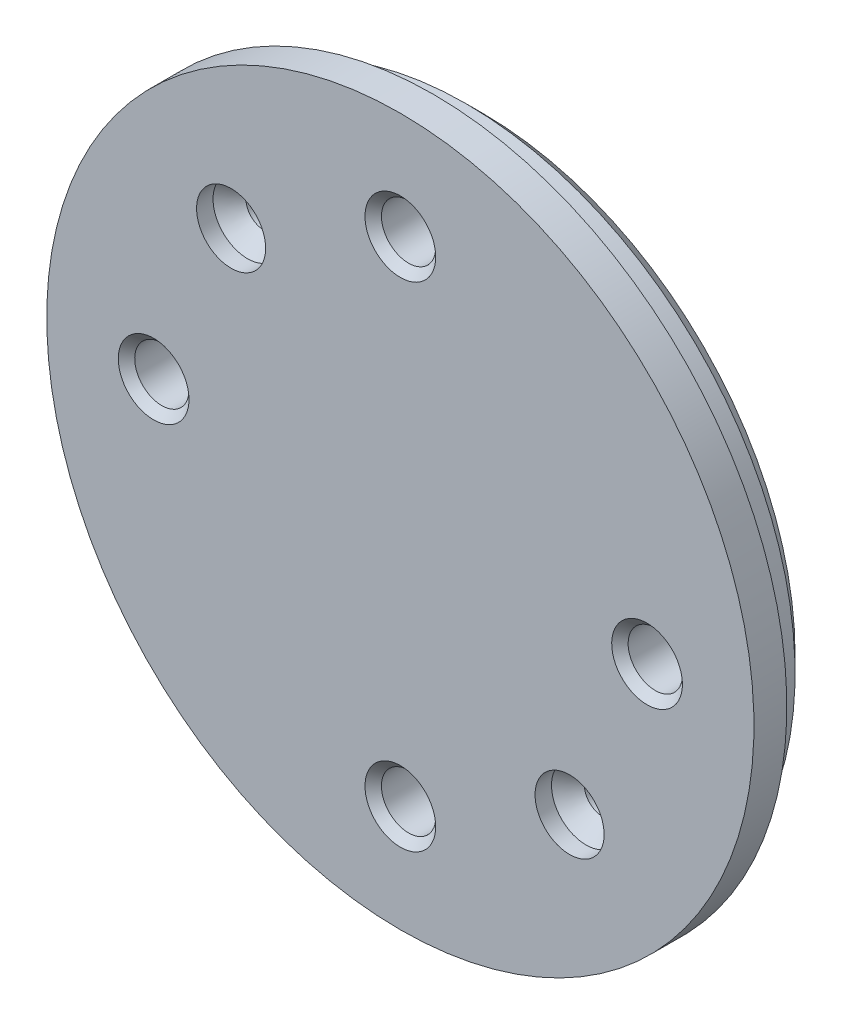
ISO-10303-21;
HEADER;
FILE_DESCRIPTION(('STEP AP214'),'2;1');
FILE_NAME('part.step','',(''),(''),'','','');
FILE_SCHEMA(('AUTOMOTIVE_DESIGN { 1 0 10303 214 1 1 1 1 }'));
ENDSEC;
DATA;
#1=APPLICATION_CONTEXT('core data for automotive mechanical design processes');
#2=APPLICATION_PROTOCOL_DEFINITION('international standard','automotive_design',2000,#1);
#3=PRODUCT_CONTEXT('',#1,'mechanical');
#4=PRODUCT('Part','Part','',(#3));
#5=PRODUCT_RELATED_PRODUCT_CATEGORY('part','',(#4));
#6=PRODUCT_DEFINITION_FORMATION('','',#4);
#7=PRODUCT_DEFINITION_CONTEXT('part definition',#1,'design');
#8=PRODUCT_DEFINITION('design','',#6,#7);
#9=PRODUCT_DEFINITION_SHAPE('','',#8);
#10=(LENGTH_UNIT() NAMED_UNIT(*) SI_UNIT(.MILLI.,.METRE.));
#11=(NAMED_UNIT(*) PLANE_ANGLE_UNIT() SI_UNIT($,.RADIAN.));
#12=(NAMED_UNIT(*) SI_UNIT($,.STERADIAN.) SOLID_ANGLE_UNIT());
#13=UNCERTAINTY_MEASURE_WITH_UNIT(LENGTH_MEASURE(1.E-05),#10,'distance_accuracy_value','');
#14=(GEOMETRIC_REPRESENTATION_CONTEXT(3) GLOBAL_UNCERTAINTY_ASSIGNED_CONTEXT((#13)) GLOBAL_UNIT_ASSIGNED_CONTEXT((#10,
#11,#12)) REPRESENTATION_CONTEXT('',''));
#15=CARTESIAN_POINT('',(0.,0.,0.));
#16=DIRECTION('',(0.,0.,1.));
#17=DIRECTION('',(1.,0.,0.));
#18=AXIS2_PLACEMENT_3D('',#15,#16,#17);
#19=CARTESIAN_POINT('',(0.,0.,0.));
#20=DIRECTION('',(0.,0.,1.));
#21=DIRECTION('',(0.,-1.,0.));
#22=AXIS2_PLACEMENT_3D('',#19,#20,#21);
#23=PLANE('',#22);
#24=CARTESIAN_POINT('',(10.2901453300087,-10.2901453300087,0.));
#25=DIRECTION('',(0.,0.,1.));
#26=DIRECTION('',(-1.,0.,0.));
#27=AXIS2_PLACEMENT_3D('',#24,#25,#26);
#28=CIRCLE('',#27,2.1);
#29=CARTESIAN_POINT('',(8.19014533000868,-10.2901453300087,0.));
#30=VERTEX_POINT('',#29);
#31=EDGE_CURVE('E139',#30,#30,#28,.T.);
#32=ORIENTED_EDGE('',*,*,#31,.F.);
#33=EDGE_LOOP('',(#32));
#34=FACE_BOUND('',#33,.T.);
#35=CARTESIAN_POINT('',(-10.2901453300087,10.2901453300087,0.));
#36=DIRECTION('',(0.,0.,1.));
#37=DIRECTION('',(1.,0.,0.));
#38=AXIS2_PLACEMENT_3D('',#35,#36,#37);
#39=CIRCLE('',#38,2.1);
#40=CARTESIAN_POINT('',(-8.19014533000868,10.2901453300087,0.));
#41=VERTEX_POINT('',#40);
#42=EDGE_CURVE('E108',#41,#41,#39,.T.);
#43=ORIENTED_EDGE('',*,*,#42,.F.);
#44=EDGE_LOOP('',(#43));
#45=FACE_BOUND('',#44,.T.);
#46=CARTESIAN_POINT('',(15.,1.57116660247941E-13,0.));
#47=DIRECTION('',(0.,0.,1.));
#48=DIRECTION('',(0.,-1.,0.));
#49=AXIS2_PLACEMENT_3D('',#46,#47,#48);
#50=CIRCLE('',#49,2.15000000000001);
#51=CARTESIAN_POINT('',(15.,-2.14999999999986,0.));
#52=VERTEX_POINT('',#51);
#53=EDGE_CURVE('E70',#52,#52,#50,.F.);
#54=ORIENTED_EDGE('',*,*,#53,.T.);
#55=EDGE_LOOP('',(#54));
#56=FACE_BOUND('',#55,.T.);
#57=CARTESIAN_POINT('',(0.,-15.,0.));
#58=DIRECTION('',(0.,0.,1.));
#59=DIRECTION('',(0.,-1.,0.));
#60=AXIS2_PLACEMENT_3D('',#57,#58,#59);
#61=CIRCLE('',#60,2.15000000000001);
#62=CARTESIAN_POINT('',(0.,-17.15,0.));
#63=VERTEX_POINT('',#62);
#64=EDGE_CURVE('E78',#63,#63,#61,.F.);
#65=ORIENTED_EDGE('',*,*,#64,.T.);
#66=EDGE_LOOP('',(#65));
#67=FACE_BOUND('',#66,.T.);
#68=CARTESIAN_POINT('',(-15.,0.,0.));
#69=DIRECTION('',(0.,0.,1.));
#70=DIRECTION('',(0.,-1.,0.));
#71=AXIS2_PLACEMENT_3D('',#68,#69,#70);
#72=CIRCLE('',#71,2.15000000000001);
#73=CARTESIAN_POINT('',(-15.,-2.15000000000007,0.));
#74=VERTEX_POINT('',#73);
#75=EDGE_CURVE('E86',#74,#74,#72,.F.);
#76=ORIENTED_EDGE('',*,*,#75,.T.);
#77=EDGE_LOOP('',(#76));
#78=FACE_BOUND('',#77,.T.);
#79=CARTESIAN_POINT('',(0.,15.,0.));
#80=DIRECTION('',(0.,0.,1.));
#81=DIRECTION('',(0.,-1.,0.));
#82=AXIS2_PLACEMENT_3D('',#79,#80,#81);
#83=CIRCLE('',#82,2.15000000000001);
#84=CARTESIAN_POINT('',(0.,12.85,0.));
#85=VERTEX_POINT('',#84);
#86=EDGE_CURVE('E94',#85,#85,#83,.F.);
#87=ORIENTED_EDGE('',*,*,#86,.T.);
#88=EDGE_LOOP('',(#87));
#89=FACE_BOUND('',#88,.T.);
#90=CARTESIAN_POINT('',(0.,0.,0.));
#91=DIRECTION('',(0.,0.,-1.));
#92=DIRECTION('',(0.,1.,0.));
#93=AXIS2_PLACEMENT_3D('',#90,#91,#92);
#94=CIRCLE('',#93,21.5);
#95=CARTESIAN_POINT('',(0.,21.5,0.));
#96=VERTEX_POINT('',#95);
#97=EDGE_CURVE('E116',#96,#96,#94,.T.);
#98=ORIENTED_EDGE('',*,*,#97,.F.);
#99=EDGE_LOOP('',(#98));
#100=FACE_BOUND('',#99,.T.);
#101=ADVANCED_FACE('F45',(#34,#45,#56,#67,#78,#89,#100),#23,.T.);
#102=CARTESIAN_POINT('',(0.,0.,-5.));
#103=DIRECTION('',(0.,0.,-1.));
#104=DIRECTION('',(0.,1.,0.));
#105=AXIS2_PLACEMENT_3D('',#102,#103,#104);
#106=CYLINDRICAL_SURFACE('',#105,21.5);
#107=ORIENTED_EDGE('',*,*,#97,.T.);
#108=EDGE_LOOP('',(#107));
#109=FACE_BOUND('',#108,.T.);
#110=CARTESIAN_POINT('',(0.,0.,-2.));
#111=DIRECTION('',(0.,0.,-1.));
#112=DIRECTION('',(0.,1.,0.));
#113=AXIS2_PLACEMENT_3D('',#110,#111,#112);
#114=CIRCLE('',#113,21.5);
#115=CARTESIAN_POINT('',(0.,21.5,-2.));
#116=VERTEX_POINT('',#115);
#117=EDGE_CURVE('E124',#116,#116,#114,.T.);
#118=ORIENTED_EDGE('',*,*,#117,.F.);
#119=EDGE_LOOP('',(#118));
#120=FACE_BOUND('',#119,.T.);
#121=ADVANCED_FACE('F178',(#109,#120),#106,.T.);
#122=CARTESIAN_POINT('',(0.,21.5,-2.));
#123=DIRECTION('',(0.,0.,-1.));
#124=DIRECTION('',(0.,1.,0.));
#125=AXIS2_PLACEMENT_3D('',#122,#123,#124);
#126=PLANE('',#125);
#127=ORIENTED_EDGE('',*,*,#117,.T.);
#128=EDGE_LOOP('',(#127));
#129=FACE_BOUND('',#128,.T.);
#130=CARTESIAN_POINT('',(0.,0.,-2.));
#131=DIRECTION('',(0.,0.,-1.));
#132=DIRECTION('',(0.,1.,0.));
#133=AXIS2_PLACEMENT_3D('',#130,#131,#132);
#134=CIRCLE('',#133,20.);
#135=CARTESIAN_POINT('',(0.,20.,-2.));
#136=VERTEX_POINT('',#135);
#137=EDGE_CURVE('E120',#136,#136,#134,.T.);
#138=ORIENTED_EDGE('',*,*,#137,.F.);
#139=EDGE_LOOP('',(#138));
#140=FACE_BOUND('',#139,.T.);
#141=ADVANCED_FACE('F185',(#129,#140),#126,.T.);
#142=CARTESIAN_POINT('',(0.,0.,-5.));
#143=DIRECTION('',(0.,0.,-1.));
#144=DIRECTION('',(0.,1.,0.));
#145=AXIS2_PLACEMENT_3D('',#142,#143,#144);
#146=CYLINDRICAL_SURFACE('',#145,20.);
#147=CARTESIAN_POINT('',(0.,0.,-4.));
#148=DIRECTION('',(0.,0.,-1.));
#149=DIRECTION('',(0.,1.,0.));
#150=AXIS2_PLACEMENT_3D('',#147,#148,#149);
#151=CIRCLE('',#150,20.);
#152=CARTESIAN_POINT('',(0.,20.,-4.));
#153=VERTEX_POINT('',#152);
#154=EDGE_CURVE('E10',#153,#153,#151,.F.);
#155=ORIENTED_EDGE('',*,*,#154,.T.);
#156=EDGE_LOOP('',(#155));
#157=FACE_BOUND('',#156,.T.);
#158=ORIENTED_EDGE('',*,*,#137,.T.);
#159=EDGE_LOOP('',(#158));
#160=FACE_BOUND('',#159,.T.);
#161=ADVANCED_FACE('F257',(#157,#160),#146,.T.);
#162=CARTESIAN_POINT('',(0.,20.,-5.));
#163=DIRECTION('',(0.,0.,-1.));
#164=DIRECTION('',(0.,1.,0.));
#165=AXIS2_PLACEMENT_3D('',#162,#163,#164);
#166=PLANE('',#165);
#167=CARTESIAN_POINT('',(0.,0.,-5.));
#168=DIRECTION('',(0.,0.,-1.));
#169=DIRECTION('',(0.,1.,0.));
#170=AXIS2_PLACEMENT_3D('',#167,#168,#169);
#171=CIRCLE('',#170,19.);
#172=CARTESIAN_POINT('',(0.,19.,-5.));
#173=VERTEX_POINT('',#172);
#174=EDGE_CURVE('E54',#173,#173,#171,.T.);
#175=ORIENTED_EDGE('',*,*,#174,.T.);
#176=EDGE_LOOP('',(#175));
#177=FACE_BOUND('',#176,.T.);
#178=CARTESIAN_POINT('',(10.2901453300087,-10.2901453300087,-5.));
#179=DIRECTION('',(0.,0.,1.));
#180=DIRECTION('',(-1.,0.,0.));
#181=AXIS2_PLACEMENT_3D('',#178,#179,#180);
#182=CIRCLE('',#181,1.09999999999999);
#183=CARTESIAN_POINT('',(9.19014533000869,-10.2901453300087,-5.));
#184=VERTEX_POINT('',#183);
#185=EDGE_CURVE('E146',#184,#184,#182,.T.);
#186=ORIENTED_EDGE('',*,*,#185,.T.);
#187=EDGE_LOOP('',(#186));
#188=FACE_BOUND('',#187,.T.);
#189=CARTESIAN_POINT('',(-10.2901453300087,10.2901453300087,-5.));
#190=DIRECTION('',(0.,0.,1.));
#191=DIRECTION('',(1.,0.,0.));
#192=AXIS2_PLACEMENT_3D('',#189,#190,#191);
#193=CIRCLE('',#192,1.09999999999999);
#194=CARTESIAN_POINT('',(-9.19014533000869,10.2901453300087,-5.));
#195=VERTEX_POINT('',#194);
#196=EDGE_CURVE('E134',#195,#195,#193,.T.);
#197=ORIENTED_EDGE('',*,*,#196,.T.);
#198=EDGE_LOOP('',(#197));
#199=FACE_BOUND('',#198,.T.);
#200=CARTESIAN_POINT('',(-15.,0.,-5.));
#201=DIRECTION('',(0.,0.,-1.));
#202=DIRECTION('',(0.,1.,0.));
#203=AXIS2_PLACEMENT_3D('',#200,#201,#202);
#204=CIRCLE('',#203,1.65);
#205=CARTESIAN_POINT('',(-15.,1.64999999999995,-5.));
#206=VERTEX_POINT('',#205);
#207=EDGE_CURVE('E95',#206,#206,#204,.T.);
#208=ORIENTED_EDGE('',*,*,#207,.F.);
#209=EDGE_LOOP('',(#208));
#210=FACE_BOUND('',#209,.T.);
#211=CARTESIAN_POINT('',(0.,-15.,-5.));
#212=DIRECTION('',(0.,0.,-1.));
#213=DIRECTION('',(0.,1.,0.));
#214=AXIS2_PLACEMENT_3D('',#211,#212,#213);
#215=CIRCLE('',#214,1.65);
#216=CARTESIAN_POINT('',(0.,-13.35,-5.));
#217=VERTEX_POINT('',#216);
#218=EDGE_CURVE('E100',#217,#217,#215,.T.);
#219=ORIENTED_EDGE('',*,*,#218,.F.);
#220=EDGE_LOOP('',(#219));
#221=FACE_BOUND('',#220,.T.);
#222=CARTESIAN_POINT('',(15.,1.56943144717851E-13,-5.));
#223=DIRECTION('',(0.,0.,-1.));
#224=DIRECTION('',(0.,1.,0.));
#225=AXIS2_PLACEMENT_3D('',#222,#223,#224);
#226=CIRCLE('',#225,1.65);
#227=CARTESIAN_POINT('',(15.,1.65000000000016,-5.));
#228=VERTEX_POINT('',#227);
#229=EDGE_CURVE('E104',#228,#228,#226,.T.);
#230=ORIENTED_EDGE('',*,*,#229,.F.);
#231=EDGE_LOOP('',(#230));
#232=FACE_BOUND('',#231,.T.);
#233=CARTESIAN_POINT('',(0.,15.,-5.));
#234=DIRECTION('',(0.,0.,-1.));
#235=DIRECTION('',(0.,1.,0.));
#236=AXIS2_PLACEMENT_3D('',#233,#234,#235);
#237=CIRCLE('',#236,1.65);
#238=CARTESIAN_POINT('',(0.,16.65,-5.));
#239=VERTEX_POINT('',#238);
#240=EDGE_CURVE('E99',#239,#239,#237,.T.);
#241=ORIENTED_EDGE('',*,*,#240,.F.);
#242=EDGE_LOOP('',(#241));
#243=FACE_BOUND('',#242,.T.);
#244=ADVANCED_FACE('F155',(#177,#188,#199,#210,#221,#232,#243),#166,.T.);
#245=CARTESIAN_POINT('',(0.,15.,-10.));
#246=DIRECTION('',(0.,0.,1.));
#247=DIRECTION('',(1.,0.,0.));
#248=AXIS2_PLACEMENT_3D('',#245,#246,#247);
#249=CYLINDRICAL_SURFACE('',#248,1.65);
#250=CARTESIAN_POINT('',(0.,15.,-0.500000000000011));
#251=DIRECTION('',(0.,0.,1.));
#252=DIRECTION('',(1.,0.,0.));
#253=AXIS2_PLACEMENT_3D('',#250,#251,#252);
#254=CIRCLE('',#253,1.65);
#255=CARTESIAN_POINT('',(1.65,15.,-0.500000000000011));
#256=VERTEX_POINT('',#255);
#257=EDGE_CURVE('E112',#256,#256,#254,.T.);
#258=ORIENTED_EDGE('',*,*,#257,.T.);
#259=EDGE_LOOP('',(#258));
#260=FACE_BOUND('',#259,.T.);
#261=ORIENTED_EDGE('',*,*,#240,.T.);
#262=EDGE_LOOP('',(#261));
#263=FACE_BOUND('',#262,.T.);
#264=ADVANCED_FACE('F200',(#260,#263),#249,.F.);
#265=CARTESIAN_POINT('',(0.,15.,-0.500000000000011));
#266=DIRECTION('',(0.,0.,1.));
#267=DIRECTION('',(1.,0.,0.));
#268=AXIS2_PLACEMENT_3D('',#265,#266,#267);
#269=CONICAL_SURFACE('',#268,1.65,0.78539816339745);
#270=ORIENTED_EDGE('',*,*,#86,.F.);
#271=EDGE_LOOP('',(#270));
#272=FACE_BOUND('',#271,.T.);
#273=ORIENTED_EDGE('',*,*,#257,.F.);
#274=EDGE_LOOP('',(#273));
#275=FACE_BOUND('',#274,.T.);
#276=ADVANCED_FACE('F193',(#272,#275),#269,.F.);
#277=CARTESIAN_POINT('',(15.,1.56769629187761E-13,-10.));
#278=DIRECTION('',(0.,0.,1.));
#279=DIRECTION('',(1.,0.,0.));
#280=AXIS2_PLACEMENT_3D('',#277,#278,#279);
#281=CYLINDRICAL_SURFACE('',#280,1.65);
#282=CARTESIAN_POINT('',(15.,1.57099308694932E-13,-0.500000000000011));
#283=DIRECTION('',(0.,0.,1.));
#284=DIRECTION('',(0.,-1.,0.));
#285=AXIS2_PLACEMENT_3D('',#282,#283,#284);
#286=CIRCLE('',#285,1.65);
#287=CARTESIAN_POINT('',(15.,-1.64999999999984,-0.500000000000011));
#288=VERTEX_POINT('',#287);
#289=EDGE_CURVE('E74',#288,#288,#286,.T.);
#290=ORIENTED_EDGE('',*,*,#289,.T.);
#291=EDGE_LOOP('',(#290));
#292=FACE_BOUND('',#291,.T.);
#293=ORIENTED_EDGE('',*,*,#229,.T.);
#294=EDGE_LOOP('',(#293));
#295=FACE_BOUND('',#294,.T.);
#296=ADVANCED_FACE('F199',(#292,#295),#281,.F.);
#297=CARTESIAN_POINT('',(0.,-15.,-10.));
#298=DIRECTION('',(0.,0.,1.));
#299=DIRECTION('',(0.,-1.,0.));
#300=AXIS2_PLACEMENT_3D('',#297,#298,#299);
#301=CYLINDRICAL_SURFACE('',#300,1.65);
#302=CARTESIAN_POINT('',(0.,-15.,-0.500000000000011));
#303=DIRECTION('',(0.,0.,1.));
#304=DIRECTION('',(1.,0.,0.));
#305=AXIS2_PLACEMENT_3D('',#302,#303,#304);
#306=CIRCLE('',#305,1.65);
#307=CARTESIAN_POINT('',(1.65,-15.,-0.500000000000011));
#308=VERTEX_POINT('',#307);
#309=EDGE_CURVE('E82',#308,#308,#306,.T.);
#310=ORIENTED_EDGE('',*,*,#309,.T.);
#311=EDGE_LOOP('',(#310));
#312=FACE_BOUND('',#311,.T.);
#313=ORIENTED_EDGE('',*,*,#218,.T.);
#314=EDGE_LOOP('',(#313));
#315=FACE_BOUND('',#314,.T.);
#316=ADVANCED_FACE('F272',(#312,#315),#301,.F.);
#317=CARTESIAN_POINT('',(-15.,0.,-10.));
#318=DIRECTION('',(0.,0.,1.));
#319=DIRECTION('',(0.,-1.,0.));
#320=AXIS2_PLACEMENT_3D('',#317,#318,#319);
#321=CYLINDRICAL_SURFACE('',#320,1.65);
#322=CARTESIAN_POINT('',(-15.,0.,-0.500000000000011));
#323=DIRECTION('',(0.,0.,1.));
#324=DIRECTION('',(0.,-1.,0.));
#325=AXIS2_PLACEMENT_3D('',#322,#323,#324);
#326=CIRCLE('',#325,1.65);
#327=CARTESIAN_POINT('',(-15.,-1.65000000000005,-0.500000000000011));
#328=VERTEX_POINT('',#327);
#329=EDGE_CURVE('E90',#328,#328,#326,.T.);
#330=ORIENTED_EDGE('',*,*,#329,.T.);
#331=EDGE_LOOP('',(#330));
#332=FACE_BOUND('',#331,.T.);
#333=ORIENTED_EDGE('',*,*,#207,.T.);
#334=EDGE_LOOP('',(#333));
#335=FACE_BOUND('',#334,.T.);
#336=ADVANCED_FACE('F209',(#332,#335),#321,.F.);
#337=CARTESIAN_POINT('',(-15.,0.,-0.500000000000011));
#338=DIRECTION('',(0.,0.,1.));
#339=DIRECTION('',(0.,-1.,0.));
#340=AXIS2_PLACEMENT_3D('',#337,#338,#339);
#341=CONICAL_SURFACE('',#340,1.65,0.78539816339745);
#342=ORIENTED_EDGE('',*,*,#75,.F.);
#343=EDGE_LOOP('',(#342));
#344=FACE_BOUND('',#343,.T.);
#345=ORIENTED_EDGE('',*,*,#329,.F.);
#346=EDGE_LOOP('',(#345));
#347=FACE_BOUND('',#346,.T.);
#348=ADVANCED_FACE('F202',(#344,#347),#341,.F.);
#349=CARTESIAN_POINT('',(0.,-15.,-0.500000000000011));
#350=DIRECTION('',(0.,0.,1.));
#351=DIRECTION('',(1.,0.,0.));
#352=AXIS2_PLACEMENT_3D('',#349,#350,#351);
#353=CONICAL_SURFACE('',#352,1.65,0.78539816339745);
#354=ORIENTED_EDGE('',*,*,#64,.F.);
#355=EDGE_LOOP('',(#354));
#356=FACE_BOUND('',#355,.T.);
#357=ORIENTED_EDGE('',*,*,#309,.F.);
#358=EDGE_LOOP('',(#357));
#359=FACE_BOUND('',#358,.T.);
#360=ADVANCED_FACE('F208',(#356,#359),#353,.F.);
#361=CARTESIAN_POINT('',(15.,1.57099308694932E-13,-0.500000000000011));
#362=DIRECTION('',(0.,0.,1.));
#363=DIRECTION('',(0.,-1.,0.));
#364=AXIS2_PLACEMENT_3D('',#361,#362,#363);
#365=CONICAL_SURFACE('',#364,1.65,0.78539816339745);
#366=ORIENTED_EDGE('',*,*,#53,.F.);
#367=EDGE_LOOP('',(#366));
#368=FACE_BOUND('',#367,.T.);
#369=ORIENTED_EDGE('',*,*,#289,.F.);
#370=EDGE_LOOP('',(#369));
#371=FACE_BOUND('',#370,.T.);
#372=ADVANCED_FACE('F216',(#368,#371),#365,.F.);
#373=CARTESIAN_POINT('',(-10.2901453300087,10.2901453300087,-2.));
#374=DIRECTION('',(0.,0.,1.));
#375=DIRECTION('',(1.,0.,0.));
#376=AXIS2_PLACEMENT_3D('',#373,#374,#375);
#377=CYLINDRICAL_SURFACE('',#376,2.1);
#378=CARTESIAN_POINT('',(-10.2901453300087,10.2901453300087,-0.999999999999997));
#379=DIRECTION('',(0.,0.,1.));
#380=DIRECTION('',(1.,0.,0.));
#381=AXIS2_PLACEMENT_3D('',#378,#379,#380);
#382=CIRCLE('',#381,2.1);
#383=CARTESIAN_POINT('',(-8.19014533000868,10.2901453300087,-0.999999999999997));
#384=VERTEX_POINT('',#383);
#385=EDGE_CURVE('E64',#384,#384,#382,.F.);
#386=ORIENTED_EDGE('',*,*,#385,.T.);
#387=EDGE_LOOP('',(#386));
#388=FACE_BOUND('',#387,.T.);
#389=ORIENTED_EDGE('',*,*,#42,.T.);
#390=EDGE_LOOP('',(#389));
#391=FACE_BOUND('',#390,.T.);
#392=ADVANCED_FACE('F222',(#388,#391),#377,.F.);
#393=CARTESIAN_POINT('',(-10.2901453300087,10.2901453300087,-2.));
#394=DIRECTION('',(0.,0.,1.));
#395=DIRECTION('',(1.,0.,0.));
#396=AXIS2_PLACEMENT_3D('',#393,#394,#395);
#397=CONICAL_SURFACE('',#396,1.09999999999999,0.785398163397452);
#398=ORIENTED_EDGE('',*,*,#385,.F.);
#399=EDGE_LOOP('',(#398));
#400=FACE_BOUND('',#399,.T.);
#401=CARTESIAN_POINT('',(-10.2901453300087,10.2901453300087,-2.));
#402=DIRECTION('',(0.,0.,1.));
#403=DIRECTION('',(1.,0.,0.));
#404=AXIS2_PLACEMENT_3D('',#401,#402,#403);
#405=CIRCLE('',#404,1.09999999999999);
#406=CARTESIAN_POINT('',(-9.19014533000869,10.2901453300087,-2.));
#407=VERTEX_POINT('',#406);
#408=EDGE_CURVE('E135',#407,#407,#405,.T.);
#409=ORIENTED_EDGE('',*,*,#408,.F.);
#410=EDGE_LOOP('',(#409));
#411=FACE_BOUND('',#410,.T.);
#412=ADVANCED_FACE('F224',(#400,#411),#397,.F.);
#413=CARTESIAN_POINT('',(-10.2901453300087,10.2901453300087,-5.));
#414=DIRECTION('',(0.,0.,1.));
#415=DIRECTION('',(1.,0.,0.));
#416=AXIS2_PLACEMENT_3D('',#413,#414,#415);
#417=CYLINDRICAL_SURFACE('',#416,1.09999999999999);
#418=ORIENTED_EDGE('',*,*,#196,.F.);
#419=EDGE_LOOP('',(#418));
#420=FACE_BOUND('',#419,.T.);
#421=ORIENTED_EDGE('',*,*,#408,.T.);
#422=EDGE_LOOP('',(#421));
#423=FACE_BOUND('',#422,.T.);
#424=ADVANCED_FACE('F171',(#420,#423),#417,.F.);
#425=CARTESIAN_POINT('',(10.2901453300087,-10.2901453300087,-2.));
#426=DIRECTION('',(0.,0.,1.));
#427=DIRECTION('',(0.,-1.,0.));
#428=AXIS2_PLACEMENT_3D('',#425,#426,#427);
#429=CYLINDRICAL_SURFACE('',#428,2.1);
#430=CARTESIAN_POINT('',(10.2901453300087,-10.2901453300087,-0.999999999999996));
#431=DIRECTION('',(0.,0.,1.));
#432=DIRECTION('',(1.,0.,0.));
#433=AXIS2_PLACEMENT_3D('',#430,#431,#432);
#434=CIRCLE('',#433,2.1);
#435=CARTESIAN_POINT('',(12.3901453300087,-10.2901453300087,-0.999999999999996));
#436=VERTEX_POINT('',#435);
#437=EDGE_CURVE('E59',#436,#436,#434,.F.);
#438=ORIENTED_EDGE('',*,*,#437,.T.);
#439=EDGE_LOOP('',(#438));
#440=FACE_BOUND('',#439,.T.);
#441=ORIENTED_EDGE('',*,*,#31,.T.);
#442=EDGE_LOOP('',(#441));
#443=FACE_BOUND('',#442,.T.);
#444=ADVANCED_FACE('F166',(#440,#443),#429,.F.);
#445=CARTESIAN_POINT('',(10.2901453300087,-10.2901453300087,-2.));
#446=DIRECTION('',(0.,0.,1.));
#447=DIRECTION('',(1.,0.,0.));
#448=AXIS2_PLACEMENT_3D('',#445,#446,#447);
#449=CONICAL_SURFACE('',#448,1.09999999999999,0.785398163397452);
#450=ORIENTED_EDGE('',*,*,#437,.F.);
#451=EDGE_LOOP('',(#450));
#452=FACE_BOUND('',#451,.T.);
#453=CARTESIAN_POINT('',(10.2901453300087,-10.2901453300087,-2.));
#454=DIRECTION('',(0.,0.,1.));
#455=DIRECTION('',(-1.,0.,0.));
#456=AXIS2_PLACEMENT_3D('',#453,#454,#455);
#457=CIRCLE('',#456,1.09999999999999);
#458=CARTESIAN_POINT('',(9.19014533000869,-10.2901453300087,-2.));
#459=VERTEX_POINT('',#458);
#460=EDGE_CURVE('E147',#459,#459,#457,.T.);
#461=ORIENTED_EDGE('',*,*,#460,.F.);
#462=EDGE_LOOP('',(#461));
#463=FACE_BOUND('',#462,.T.);
#464=ADVANCED_FACE('F161',(#452,#463),#449,.F.);
#465=CARTESIAN_POINT('',(10.2901453300087,-10.2901453300087,-5.));
#466=DIRECTION('',(0.,0.,1.));
#467=DIRECTION('',(0.,-1.,0.));
#468=AXIS2_PLACEMENT_3D('',#465,#466,#467);
#469=CYLINDRICAL_SURFACE('',#468,1.09999999999999);
#470=ORIENTED_EDGE('',*,*,#185,.F.);
#471=EDGE_LOOP('',(#470));
#472=FACE_BOUND('',#471,.T.);
#473=ORIENTED_EDGE('',*,*,#460,.T.);
#474=EDGE_LOOP('',(#473));
#475=FACE_BOUND('',#474,.T.);
#476=ADVANCED_FACE('F158',(#472,#475),#469,.F.);
#477=CARTESIAN_POINT('',(0.,0.,-5.));
#478=DIRECTION('',(0.,0.,1.));
#479=DIRECTION('',(0.,-1.,0.));
#480=AXIS2_PLACEMENT_3D('',#477,#478,#479);
#481=CONICAL_SURFACE('',#480,19.,0.785398163397448);
#482=ORIENTED_EDGE('',*,*,#154,.F.);
#483=EDGE_LOOP('',(#482));
#484=FACE_BOUND('',#483,.T.);
#485=ORIENTED_EDGE('',*,*,#174,.F.);
#486=EDGE_LOOP('',(#485));
#487=FACE_BOUND('',#486,.T.);
#488=ADVANCED_FACE('F48',(#484,#487),#481,.T.);
#489=CLOSED_SHELL('',(#101,#121,#141,#161,#244,#264,#276,#296,#316,#336,#348,#360,#372,#392,
#412,#424,#444,#464,#476,#488));
#490=MANIFOLD_SOLID_BREP('B2',#489);
#491=ADVANCED_BREP_SHAPE_REPRESENTATION('',(#18,#490),#14);
#492=SHAPE_DEFINITION_REPRESENTATION(#9,#491);
ENDSEC;
END-ISO-10303-21;
